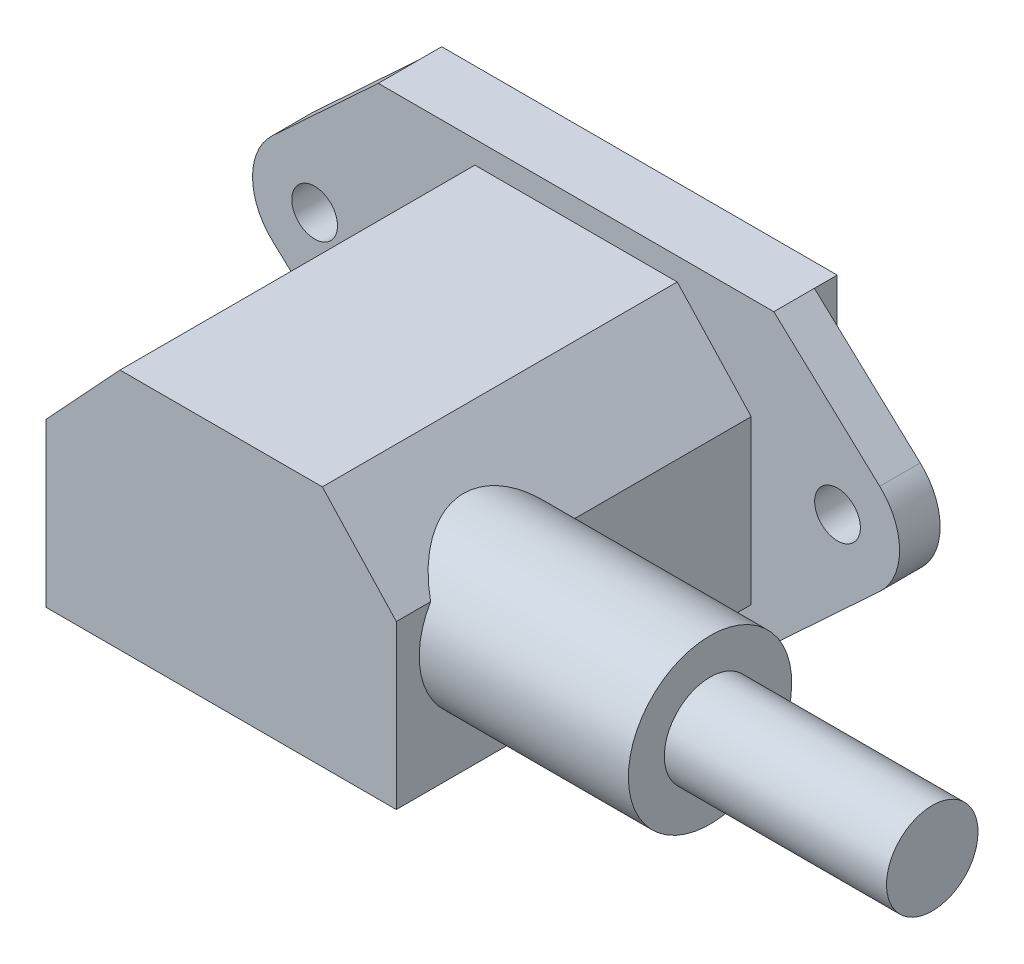
ISO-10303-21;
HEADER;
FILE_DESCRIPTION(('STEP AP214'),'2;1');
FILE_NAME('part.step','',(''),(''),'','','');
FILE_SCHEMA(('AUTOMOTIVE_DESIGN { 1 0 10303 214 1 1 1 1 }'));
ENDSEC;
DATA;
#1=APPLICATION_CONTEXT('core data for automotive mechanical design processes');
#2=APPLICATION_PROTOCOL_DEFINITION('international standard','automotive_design',2000,#1);
#3=PRODUCT_CONTEXT('',#1,'mechanical');
#4=PRODUCT('Part','Part','',(#3));
#5=PRODUCT_RELATED_PRODUCT_CATEGORY('part','',(#4));
#6=PRODUCT_DEFINITION_FORMATION('','',#4);
#7=PRODUCT_DEFINITION_CONTEXT('part definition',#1,'design');
#8=PRODUCT_DEFINITION('design','',#6,#7);
#9=PRODUCT_DEFINITION_SHAPE('','',#8);
#10=(LENGTH_UNIT() NAMED_UNIT(*) SI_UNIT(.MILLI.,.METRE.));
#11=(NAMED_UNIT(*) PLANE_ANGLE_UNIT() SI_UNIT($,.RADIAN.));
#12=(NAMED_UNIT(*) SI_UNIT($,.STERADIAN.) SOLID_ANGLE_UNIT());
#13=UNCERTAINTY_MEASURE_WITH_UNIT(LENGTH_MEASURE(1.E-05),#10,'distance_accuracy_value','');
#14=(GEOMETRIC_REPRESENTATION_CONTEXT(3) GLOBAL_UNCERTAINTY_ASSIGNED_CONTEXT((#13)) GLOBAL_UNIT_ASSIGNED_CONTEXT((#10,
#11,#12)) REPRESENTATION_CONTEXT('',''));
#15=CARTESIAN_POINT('',(0.,0.,0.));
#16=DIRECTION('',(0.,0.,1.));
#17=DIRECTION('',(1.,0.,0.));
#18=AXIS2_PLACEMENT_3D('',#15,#16,#17);
#19=CARTESIAN_POINT('',(-20.,8.15,4.85));
#20=DIRECTION('',(0.,0.,1.));
#21=DIRECTION('',(1.,0.,0.));
#22=AXIS2_PLACEMENT_3D('',#19,#20,#21);
#23=PLANE('',#22);
#24=CARTESIAN_POINT('',(-20.,8.15,4.85));
#25=DIRECTION('',(0.,0.,1.));
#26=DIRECTION('',(1.,0.,0.));
#27=AXIS2_PLACEMENT_3D('',#24,#25,#26);
#28=CIRCLE('',#27,1.75);
#29=CARTESIAN_POINT('',(-21.75,8.15,4.85));
#30=VERTEX_POINT('',#29);
#31=EDGE_CURVE('E291',#30,#30,#28,.T.);
#32=ORIENTED_EDGE('',*,*,#31,.F.);
#33=EDGE_LOOP('',(#32));
#34=FACE_BOUND('',#33,.T.);
#35=DIRECTION('',(-0.73298236468774,-0.680247640978466,0.));
#36=VECTOR('',#35,1.);
#37=CARTESIAN_POINT('',(-15.13,19.15,4.85));
#38=LINE('',#37,#36);
#39=CARTESIAN_POINT('',(-15.13,19.15,4.85));
#40=VERTEX_POINT('',#39);
#41=CARTESIAN_POINT('',(-23.2311762946477,11.6316662322668,4.85));
#42=VERTEX_POINT('',#41);
#43=EDGE_CURVE('E297',#40,#42,#38,.T.);
#44=ORIENTED_EDGE('',*,*,#43,.T.);
#45=CARTESIAN_POINT('',(-20.,8.15,4.85));
#46=DIRECTION('',(0.,0.,1.));
#47=DIRECTION('',(1.,0.,0.));
#48=AXIS2_PLACEMENT_3D('',#45,#46,#47);
#49=CIRCLE('',#48,4.75000000000001);
#50=CARTESIAN_POINT('',(-23.2311762946477,4.66833376773322,4.85));
#51=VERTEX_POINT('',#50);
#52=EDGE_CURVE('E300',#42,#51,#49,.T.);
#53=ORIENTED_EDGE('',*,*,#52,.T.);
#54=DIRECTION('',(0.732982364687741,-0.680247640978466,0.));
#55=VECTOR('',#54,1.);
#56=CARTESIAN_POINT('',(-23.2311762946477,4.66833376773322,4.85));
#57=LINE('',#56,#55);
#58=CARTESIAN_POINT('',(-15.13,-2.85,4.85));
#59=VERTEX_POINT('',#58);
#60=EDGE_CURVE('E303',#51,#59,#57,.T.);
#61=ORIENTED_EDGE('',*,*,#60,.T.);
#62=DIRECTION('',(1.,0.,0.));
#63=VECTOR('',#62,1.);
#64=CARTESIAN_POINT('',(15.13,-2.85,4.85));
#65=LINE('',#64,#63);
#66=CARTESIAN_POINT('',(15.13,-2.85,4.85));
#67=VERTEX_POINT('',#66);
#68=EDGE_CURVE('E305',#59,#67,#65,.T.);
#69=ORIENTED_EDGE('',*,*,#68,.T.);
#70=DIRECTION('',(0.73298236468774,0.680247640978467,0.));
#71=VECTOR('',#70,1.);
#72=CARTESIAN_POINT('',(23.2311762946477,4.66833376773322,4.85));
#73=LINE('',#72,#71);
#74=CARTESIAN_POINT('',(23.2311762946477,4.66833376773322,4.85));
#75=VERTEX_POINT('',#74);
#76=EDGE_CURVE('E307',#67,#75,#73,.T.);
#77=ORIENTED_EDGE('',*,*,#76,.T.);
#78=CARTESIAN_POINT('',(20.,8.15,4.85));
#79=DIRECTION('',(0.,0.,1.));
#80=DIRECTION('',(-1.,0.,0.));
#81=AXIS2_PLACEMENT_3D('',#78,#79,#80);
#82=CIRCLE('',#81,4.75000000000001);
#83=CARTESIAN_POINT('',(23.2311762946477,11.6316662322668,4.85));
#84=VERTEX_POINT('',#83);
#85=EDGE_CURVE('E309',#75,#84,#82,.T.);
#86=ORIENTED_EDGE('',*,*,#85,.T.);
#87=DIRECTION('',(-0.73298236468774,0.680247640978467,0.));
#88=VECTOR('',#87,1.);
#89=CARTESIAN_POINT('',(15.13,19.15,4.85));
#90=LINE('',#89,#88);
#91=CARTESIAN_POINT('',(15.13,19.15,4.85));
#92=VERTEX_POINT('',#91);
#93=EDGE_CURVE('E311',#84,#92,#90,.T.);
#94=ORIENTED_EDGE('',*,*,#93,.T.);
#95=DIRECTION('',(-1.,0.,0.));
#96=VECTOR('',#95,1.);
#97=CARTESIAN_POINT('',(-15.13,19.15,4.85));
#98=LINE('',#97,#96);
#99=EDGE_CURVE('E313',#92,#40,#98,.T.);
#100=ORIENTED_EDGE('',*,*,#99,.T.);
#101=EDGE_LOOP('',(#44,#53,#61,#69,#77,#86,#94,#100));
#102=FACE_BOUND('',#101,.T.);
#103=CARTESIAN_POINT('',(20.,8.15,4.85));
#104=DIRECTION('',(0.,0.,1.));
#105=DIRECTION('',(1.,0.,0.));
#106=AXIS2_PLACEMENT_3D('',#103,#104,#105);
#107=CIRCLE('',#106,1.75);
#108=CARTESIAN_POINT('',(18.25,8.15,4.85));
#109=VERTEX_POINT('',#108);
#110=EDGE_CURVE('E285',#109,#109,#107,.T.);
#111=ORIENTED_EDGE('',*,*,#110,.F.);
#112=EDGE_LOOP('',(#111));
#113=FACE_BOUND('',#112,.T.);
#114=DIRECTION('',(0.,-1.,0.));
#115=VECTOR('',#114,1.);
#116=CARTESIAN_POINT('',(-13.4,-1.125,4.85));
#117=LINE('',#116,#115);
#118=CARTESIAN_POINT('',(-13.4,11.3328050600255,4.85));
#119=VERTEX_POINT('',#118);
#120=CARTESIAN_POINT('',(-13.4,-1.125,4.85));
#121=VERTEX_POINT('',#120);
#122=EDGE_CURVE('E236',#119,#121,#117,.T.);
#123=ORIENTED_EDGE('',*,*,#122,.F.);
#124=DIRECTION('',(-0.680716127536649,-0.732547304760252,0.));
#125=VECTOR('',#124,1.);
#126=CARTESIAN_POINT('',(-13.4,11.3328050600255,4.85));
#127=LINE('',#126,#125);
#128=CARTESIAN_POINT('',(-7.73885658879731,17.425,4.85));
#129=VERTEX_POINT('',#128);
#130=EDGE_CURVE('E57',#129,#119,#127,.T.);
#131=ORIENTED_EDGE('',*,*,#130,.F.);
#132=DIRECTION('',(-1.,0.,0.));
#133=VECTOR('',#132,1.);
#134=CARTESIAN_POINT('',(-7.73885658879731,17.425,4.85));
#135=LINE('',#134,#133);
#136=CARTESIAN_POINT('',(7.7388565887973,17.425,4.85));
#137=VERTEX_POINT('',#136);
#138=EDGE_CURVE('E265',#137,#129,#135,.T.);
#139=ORIENTED_EDGE('',*,*,#138,.F.);
#140=DIRECTION('',(-0.680716127536649,0.732547304760251,0.));
#141=VECTOR('',#140,1.);
#142=CARTESIAN_POINT('',(13.4,11.3328050600255,4.85));
#143=LINE('',#142,#141);
#144=CARTESIAN_POINT('',(13.4,11.3328050600255,4.85));
#145=VERTEX_POINT('',#144);
#146=EDGE_CURVE('E262',#145,#137,#143,.T.);
#147=ORIENTED_EDGE('',*,*,#146,.F.);
#148=DIRECTION('',(0.,1.,0.));
#149=VECTOR('',#148,1.);
#150=CARTESIAN_POINT('',(13.4,-1.12499999999999,4.85));
#151=LINE('',#150,#149);
#152=CARTESIAN_POINT('',(13.4,-1.12499999999999,4.85));
#153=VERTEX_POINT('',#152);
#154=EDGE_CURVE('E259',#153,#145,#151,.T.);
#155=ORIENTED_EDGE('',*,*,#154,.F.);
#156=DIRECTION('',(1.,0.,0.));
#157=VECTOR('',#156,1.);
#158=CARTESIAN_POINT('',(13.4,-1.12499999999999,4.85));
#159=LINE('',#158,#157);
#160=EDGE_CURVE('E256',#121,#153,#159,.T.);
#161=ORIENTED_EDGE('',*,*,#160,.F.);
#162=EDGE_LOOP('',(#123,#131,#139,#147,#155,#161));
#163=FACE_BOUND('',#162,.T.);
#164=ADVANCED_FACE('F34',(#34,#102,#113,#163),#23,.T.);
#165=CARTESIAN_POINT('',(0.,0.,0.));
#166=DIRECTION('',(0.,0.,-1.));
#167=DIRECTION('',(-1.,0.,0.));
#168=AXIS2_PLACEMENT_3D('',#165,#166,#167);
#169=PLANE('',#168);
#170=DIRECTION('',(0.,1.,0.));
#171=VECTOR('',#170,1.);
#172=CARTESIAN_POINT('',(15.13,-2.85,0.));
#173=LINE('',#172,#171);
#174=CARTESIAN_POINT('',(15.13,-2.85,0.));
#175=VERTEX_POINT('',#174);
#176=CARTESIAN_POINT('',(15.13,19.15,0.));
#177=VERTEX_POINT('',#176);
#178=EDGE_CURVE('E201',#175,#177,#173,.T.);
#179=ORIENTED_EDGE('',*,*,#178,.F.);
#180=DIRECTION('',(1.,0.,0.));
#181=VECTOR('',#180,1.);
#182=CARTESIAN_POINT('',(-15.13,-2.85,0.));
#183=LINE('',#182,#181);
#184=CARTESIAN_POINT('',(-15.13,-2.85,0.));
#185=VERTEX_POINT('',#184);
#186=EDGE_CURVE('E379',#185,#175,#183,.T.);
#187=ORIENTED_EDGE('',*,*,#186,.F.);
#188=DIRECTION('',(0.,-1.,0.));
#189=VECTOR('',#188,1.);
#190=CARTESIAN_POINT('',(-15.13,-2.85,0.));
#191=LINE('',#190,#189);
#192=CARTESIAN_POINT('',(-15.13,19.15,0.));
#193=VERTEX_POINT('',#192);
#194=EDGE_CURVE('E387',#193,#185,#191,.T.);
#195=ORIENTED_EDGE('',*,*,#194,.F.);
#196=DIRECTION('',(-1.,0.,0.));
#197=VECTOR('',#196,1.);
#198=CARTESIAN_POINT('',(-15.13,19.15,0.));
#199=LINE('',#198,#197);
#200=EDGE_CURVE('E385',#177,#193,#199,.T.);
#201=ORIENTED_EDGE('',*,*,#200,.F.);
#202=EDGE_LOOP('',(#179,#187,#195,#201));
#203=FACE_BOUND('',#202,.T.);
#204=DIRECTION('',(1.,0.,0.));
#205=VECTOR('',#204,1.);
#206=CARTESIAN_POINT('',(-12.175,0.,0.));
#207=LINE('',#206,#205);
#208=CARTESIAN_POINT('',(-12.175,0.,0.));
#209=VERTEX_POINT('',#208);
#210=CARTESIAN_POINT('',(12.175,0.,0.));
#211=VERTEX_POINT('',#210);
#212=EDGE_CURVE('E364',#209,#211,#207,.T.);
#213=ORIENTED_EDGE('',*,*,#212,.T.);
#214=DIRECTION('',(0.,1.,0.));
#215=VECTOR('',#214,1.);
#216=CARTESIAN_POINT('',(12.175,11.,0.));
#217=LINE('',#216,#215);
#218=CARTESIAN_POINT('',(12.175,11.,0.));
#219=VERTEX_POINT('',#218);
#220=EDGE_CURVE('E352',#211,#219,#217,.T.);
#221=ORIENTED_EDGE('',*,*,#220,.T.);
#222=DIRECTION('',(-0.680716127536649,0.732547304760252,0.));
#223=VECTOR('',#222,1.);
#224=CARTESIAN_POINT('',(7.25,16.3,0.));
#225=LINE('',#224,#223);
#226=CARTESIAN_POINT('',(7.25,16.3,0.));
#227=VERTEX_POINT('',#226);
#228=EDGE_CURVE('E198',#219,#227,#225,.T.);
#229=ORIENTED_EDGE('',*,*,#228,.T.);
#230=DIRECTION('',(-1.,0.,0.));
#231=VECTOR('',#230,1.);
#232=CARTESIAN_POINT('',(7.25,16.3,0.));
#233=LINE('',#232,#231);
#234=CARTESIAN_POINT('',(-7.25,16.3,0.));
#235=VERTEX_POINT('',#234);
#236=EDGE_CURVE('E355',#227,#235,#233,.T.);
#237=ORIENTED_EDGE('',*,*,#236,.T.);
#238=DIRECTION('',(-0.680716127536649,-0.732547304760252,0.));
#239=VECTOR('',#238,1.);
#240=CARTESIAN_POINT('',(-7.25,16.3,0.));
#241=LINE('',#240,#239);
#242=CARTESIAN_POINT('',(-12.175,11.,0.));
#243=VERTEX_POINT('',#242);
#244=EDGE_CURVE('E358',#235,#243,#241,.T.);
#245=ORIENTED_EDGE('',*,*,#244,.T.);
#246=DIRECTION('',(0.,-1.,0.));
#247=VECTOR('',#246,1.);
#248=CARTESIAN_POINT('',(-12.175,11.,0.));
#249=LINE('',#248,#247);
#250=EDGE_CURVE('E361',#243,#209,#249,.T.);
#251=ORIENTED_EDGE('',*,*,#250,.T.);
#252=EDGE_LOOP('',(#213,#221,#229,#237,#245,#251));
#253=FACE_BOUND('',#252,.T.);
#254=ADVANCED_FACE('F409',(#203,#253),#169,.T.);
#255=CARTESIAN_POINT('',(15.13,-2.85,1.75));
#256=DIRECTION('',(-1.,0.,0.));
#257=DIRECTION('',(0.,-1.,0.));
#258=AXIS2_PLACEMENT_3D('',#255,#256,#257);
#259=PLANE('',#258);
#260=ORIENTED_EDGE('',*,*,#178,.T.);
#261=DIRECTION('',(0.,0.,-1.));
#262=VECTOR('',#261,1.);
#263=CARTESIAN_POINT('',(15.13,19.15,1.75));
#264=LINE('',#263,#262);
#265=CARTESIAN_POINT('',(15.13,19.15,1.75));
#266=VERTEX_POINT('',#265);
#267=EDGE_CURVE('E38',#266,#177,#264,.T.);
#268=ORIENTED_EDGE('',*,*,#267,.F.);
#269=DIRECTION('',(0.,1.,0.));
#270=VECTOR('',#269,1.);
#271=CARTESIAN_POINT('',(15.13,-2.85,1.75));
#272=LINE('',#271,#270);
#273=CARTESIAN_POINT('',(15.13,-2.85,1.75));
#274=VERTEX_POINT('',#273);
#275=EDGE_CURVE('E375',#274,#266,#272,.T.);
#276=ORIENTED_EDGE('',*,*,#275,.F.);
#277=DIRECTION('',(0.,0.,-1.));
#278=VECTOR('',#277,1.);
#279=CARTESIAN_POINT('',(15.13,-2.85,1.75));
#280=LINE('',#279,#278);
#281=EDGE_CURVE('E382',#274,#175,#280,.T.);
#282=ORIENTED_EDGE('',*,*,#281,.T.);
#283=EDGE_LOOP('',(#260,#268,#276,#282));
#284=FACE_BOUND('',#283,.T.);
#285=ADVANCED_FACE('F36',(#284),#259,.F.);
#286=CARTESIAN_POINT('',(-15.13,19.15,1.75));
#287=DIRECTION('',(0.,-1.,0.));
#288=DIRECTION('',(1.,0.,0.));
#289=AXIS2_PLACEMENT_3D('',#286,#287,#288);
#290=PLANE('',#289);
#291=ORIENTED_EDGE('',*,*,#200,.T.);
#292=DIRECTION('',(0.,0.,-1.));
#293=VECTOR('',#292,1.);
#294=CARTESIAN_POINT('',(-15.13,19.15,1.75));
#295=LINE('',#294,#293);
#296=CARTESIAN_POINT('',(-15.13,19.15,1.75));
#297=VERTEX_POINT('',#296);
#298=EDGE_CURVE('E394',#297,#193,#295,.T.);
#299=ORIENTED_EDGE('',*,*,#298,.F.);
#300=DIRECTION('',(0.,0.,-1.));
#301=VECTOR('',#300,1.);
#302=CARTESIAN_POINT('',(-15.13,19.15,4.85));
#303=LINE('',#302,#301);
#304=EDGE_CURVE('E315',#40,#297,#303,.T.);
#305=ORIENTED_EDGE('',*,*,#304,.F.);
#306=ORIENTED_EDGE('',*,*,#99,.F.);
#307=DIRECTION('',(0.,0.,-1.));
#308=VECTOR('',#307,1.);
#309=CARTESIAN_POINT('',(15.13,19.15,4.85));
#310=LINE('',#309,#308);
#311=EDGE_CURVE('E331',#92,#266,#310,.T.);
#312=ORIENTED_EDGE('',*,*,#311,.T.);
#313=ORIENTED_EDGE('',*,*,#267,.T.);
#314=EDGE_LOOP('',(#291,#299,#305,#306,#312,#313));
#315=FACE_BOUND('',#314,.T.);
#316=ADVANCED_FACE('F401',(#315),#290,.F.);
#317=CARTESIAN_POINT('',(-15.13,-2.85,1.75));
#318=DIRECTION('',(1.,0.,0.));
#319=DIRECTION('',(0.,1.,0.));
#320=AXIS2_PLACEMENT_3D('',#317,#318,#319);
#321=PLANE('',#320);
#322=ORIENTED_EDGE('',*,*,#194,.T.);
#323=DIRECTION('',(0.,0.,-1.));
#324=VECTOR('',#323,1.);
#325=CARTESIAN_POINT('',(-15.13,-2.85,1.75));
#326=LINE('',#325,#324);
#327=CARTESIAN_POINT('',(-15.13,-2.85,1.75));
#328=VERTEX_POINT('',#327);
#329=EDGE_CURVE('E392',#328,#185,#326,.T.);
#330=ORIENTED_EDGE('',*,*,#329,.F.);
#331=DIRECTION('',(0.,-1.,0.));
#332=VECTOR('',#331,1.);
#333=CARTESIAN_POINT('',(-15.13,-2.85,1.75));
#334=LINE('',#333,#332);
#335=EDGE_CURVE('E378',#297,#328,#334,.T.);
#336=ORIENTED_EDGE('',*,*,#335,.F.);
#337=ORIENTED_EDGE('',*,*,#298,.T.);
#338=EDGE_LOOP('',(#322,#330,#336,#337));
#339=FACE_BOUND('',#338,.T.);
#340=ADVANCED_FACE('F411',(#339),#321,.F.);
#341=CARTESIAN_POINT('',(-15.13,-2.85,1.75));
#342=DIRECTION('',(0.,1.,0.));
#343=DIRECTION('',(0.,0.,1.));
#344=AXIS2_PLACEMENT_3D('',#341,#342,#343);
#345=PLANE('',#344);
#346=ORIENTED_EDGE('',*,*,#186,.T.);
#347=ORIENTED_EDGE('',*,*,#281,.F.);
#348=DIRECTION('',(0.,0.,-1.));
#349=VECTOR('',#348,1.);
#350=CARTESIAN_POINT('',(15.13,-2.85,4.85));
#351=LINE('',#350,#349);
#352=EDGE_CURVE('E340',#67,#274,#351,.T.);
#353=ORIENTED_EDGE('',*,*,#352,.F.);
#354=ORIENTED_EDGE('',*,*,#68,.F.);
#355=DIRECTION('',(0.,0.,-1.));
#356=VECTOR('',#355,1.);
#357=CARTESIAN_POINT('',(-15.13,-2.85,4.85));
#358=LINE('',#357,#356);
#359=EDGE_CURVE('E343',#59,#328,#358,.T.);
#360=ORIENTED_EDGE('',*,*,#359,.T.);
#361=ORIENTED_EDGE('',*,*,#329,.T.);
#362=EDGE_LOOP('',(#346,#347,#353,#354,#360,#361));
#363=FACE_BOUND('',#362,.T.);
#364=ADVANCED_FACE('F413',(#363),#345,.F.);
#365=CARTESIAN_POINT('',(12.175,11.,1.75));
#366=DIRECTION('',(-1.,0.,0.));
#367=DIRECTION('',(0.,-1.,0.));
#368=AXIS2_PLACEMENT_3D('',#365,#366,#367);
#369=PLANE('',#368);
#370=ORIENTED_EDGE('',*,*,#220,.F.);
#371=DIRECTION('',(0.,0.,-1.));
#372=VECTOR('',#371,1.);
#373=CARTESIAN_POINT('',(12.175,0.,1.75));
#374=LINE('',#373,#372);
#375=CARTESIAN_POINT('',(12.175,0.,18.75));
#376=VERTEX_POINT('',#375);
#377=EDGE_CURVE('E208',#376,#211,#374,.T.);
#378=ORIENTED_EDGE('',*,*,#377,.F.);
#379=DIRECTION('',(0.,-1.,0.));
#380=VECTOR('',#379,1.);
#381=CARTESIAN_POINT('',(12.175,11.,18.75));
#382=LINE('',#381,#380);
#383=CARTESIAN_POINT('',(12.175,11.,18.75));
#384=VERTEX_POINT('',#383);
#385=EDGE_CURVE('E205',#384,#376,#382,.T.);
#386=ORIENTED_EDGE('',*,*,#385,.F.);
#387=DIRECTION('',(0.,0.,-1.));
#388=VECTOR('',#387,1.);
#389=CARTESIAN_POINT('',(12.175,11.,1.75));
#390=LINE('',#389,#388);
#391=EDGE_CURVE('E191',#384,#219,#390,.T.);
#392=ORIENTED_EDGE('',*,*,#391,.T.);
#393=EDGE_LOOP('',(#370,#378,#386,#392));
#394=FACE_BOUND('',#393,.T.);
#395=ADVANCED_FACE('F206',(#394),#369,.T.);
#396=CARTESIAN_POINT('',(7.25,16.3,1.75));
#397=DIRECTION('',(-0.732547304760252,-0.680716127536649,0.));
#398=DIRECTION('',(0.680716127536649,-0.732547304760252,0.));
#399=AXIS2_PLACEMENT_3D('',#396,#397,#398);
#400=PLANE('',#399);
#401=ORIENTED_EDGE('',*,*,#228,.F.);
#402=ORIENTED_EDGE('',*,*,#391,.F.);
#403=DIRECTION('',(0.680716127536649,-0.732547304760252,0.));
#404=VECTOR('',#403,1.);
#405=CARTESIAN_POINT('',(7.25,16.3,18.75));
#406=LINE('',#405,#404);
#407=CARTESIAN_POINT('',(7.25,16.3,18.75));
#408=VERTEX_POINT('',#407);
#409=EDGE_CURVE('E195',#408,#384,#406,.T.);
#410=ORIENTED_EDGE('',*,*,#409,.F.);
#411=DIRECTION('',(0.,0.,-1.));
#412=VECTOR('',#411,1.);
#413=CARTESIAN_POINT('',(7.25,16.3,1.75));
#414=LINE('',#413,#412);
#415=EDGE_CURVE('E202',#408,#227,#414,.T.);
#416=ORIENTED_EDGE('',*,*,#415,.T.);
#417=EDGE_LOOP('',(#401,#402,#410,#416));
#418=FACE_BOUND('',#417,.T.);
#419=ADVANCED_FACE('F193',(#418),#400,.T.);
#420=CARTESIAN_POINT('',(7.25,16.3,1.75));
#421=DIRECTION('',(0.,-1.,0.));
#422=DIRECTION('',(0.,0.,-1.));
#423=AXIS2_PLACEMENT_3D('',#420,#421,#422);
#424=PLANE('',#423);
#425=ORIENTED_EDGE('',*,*,#236,.F.);
#426=ORIENTED_EDGE('',*,*,#415,.F.);
#427=DIRECTION('',(1.,0.,0.));
#428=VECTOR('',#427,1.);
#429=CARTESIAN_POINT('',(-7.25,16.3,18.75));
#430=LINE('',#429,#428);
#431=CARTESIAN_POINT('',(-7.25,16.3,18.75));
#432=VERTEX_POINT('',#431);
#433=EDGE_CURVE('E217',#432,#408,#430,.T.);
#434=ORIENTED_EDGE('',*,*,#433,.F.);
#435=DIRECTION('',(0.,0.,-1.));
#436=VECTOR('',#435,1.);
#437=CARTESIAN_POINT('',(-7.25,16.3,1.75));
#438=LINE('',#437,#436);
#439=EDGE_CURVE('E372',#432,#235,#438,.T.);
#440=ORIENTED_EDGE('',*,*,#439,.T.);
#441=EDGE_LOOP('',(#425,#426,#434,#440));
#442=FACE_BOUND('',#441,.T.);
#443=ADVANCED_FACE('F628',(#442),#424,.T.);
#444=CARTESIAN_POINT('',(-7.25,16.3,1.75));
#445=DIRECTION('',(0.732547304760252,-0.680716127536649,0.));
#446=DIRECTION('',(0.680716127536649,0.732547304760252,0.));
#447=AXIS2_PLACEMENT_3D('',#444,#445,#446);
#448=PLANE('',#447);
#449=ORIENTED_EDGE('',*,*,#244,.F.);
#450=ORIENTED_EDGE('',*,*,#439,.F.);
#451=DIRECTION('',(0.680716127536649,0.732547304760252,0.));
#452=VECTOR('',#451,1.);
#453=CARTESIAN_POINT('',(-12.175,11.,18.75));
#454=LINE('',#453,#452);
#455=CARTESIAN_POINT('',(-12.175,11.,18.75));
#456=VERTEX_POINT('',#455);
#457=EDGE_CURVE('E224',#456,#432,#454,.T.);
#458=ORIENTED_EDGE('',*,*,#457,.F.);
#459=DIRECTION('',(0.,0.,-1.));
#460=VECTOR('',#459,1.);
#461=CARTESIAN_POINT('',(-12.175,11.,1.75));
#462=LINE('',#461,#460);
#463=EDGE_CURVE('E370',#456,#243,#462,.T.);
#464=ORIENTED_EDGE('',*,*,#463,.T.);
#465=EDGE_LOOP('',(#449,#450,#458,#464));
#466=FACE_BOUND('',#465,.T.);
#467=ADVANCED_FACE('F617',(#466),#448,.T.);
#468=CARTESIAN_POINT('',(-12.175,11.,1.75));
#469=DIRECTION('',(1.,0.,0.));
#470=DIRECTION('',(0.,1.,0.));
#471=AXIS2_PLACEMENT_3D('',#468,#469,#470);
#472=PLANE('',#471);
#473=ORIENTED_EDGE('',*,*,#250,.F.);
#474=ORIENTED_EDGE('',*,*,#463,.F.);
#475=DIRECTION('',(0.,1.,0.));
#476=VECTOR('',#475,1.);
#477=CARTESIAN_POINT('',(-12.175,0.,18.75));
#478=LINE('',#477,#476);
#479=CARTESIAN_POINT('',(-12.175,0.,18.75));
#480=VERTEX_POINT('',#479);
#481=EDGE_CURVE('E221',#480,#456,#478,.T.);
#482=ORIENTED_EDGE('',*,*,#481,.F.);
#483=DIRECTION('',(0.,0.,-1.));
#484=VECTOR('',#483,1.);
#485=CARTESIAN_POINT('',(-12.175,0.,1.75));
#486=LINE('',#485,#484);
#487=EDGE_CURVE('E368',#480,#209,#486,.T.);
#488=ORIENTED_EDGE('',*,*,#487,.T.);
#489=EDGE_LOOP('',(#473,#474,#482,#488));
#490=FACE_BOUND('',#489,.T.);
#491=ADVANCED_FACE('F606',(#490),#472,.T.);
#492=CARTESIAN_POINT('',(-12.175,0.,1.75));
#493=DIRECTION('',(0.,1.,0.));
#494=DIRECTION('',(0.,0.,1.));
#495=AXIS2_PLACEMENT_3D('',#492,#493,#494);
#496=PLANE('',#495);
#497=ORIENTED_EDGE('',*,*,#212,.F.);
#498=ORIENTED_EDGE('',*,*,#487,.F.);
#499=DIRECTION('',(-1.,0.,0.));
#500=VECTOR('',#499,1.);
#501=CARTESIAN_POINT('',(12.175,0.,18.75));
#502=LINE('',#501,#500);
#503=EDGE_CURVE('E212',#376,#480,#502,.T.);
#504=ORIENTED_EDGE('',*,*,#503,.F.);
#505=ORIENTED_EDGE('',*,*,#377,.T.);
#506=EDGE_LOOP('',(#497,#498,#504,#505));
#507=FACE_BOUND('',#506,.T.);
#508=ADVANCED_FACE('F470',(#507),#496,.T.);
#509=CARTESIAN_POINT('',(-20.,8.15,1.75));
#510=DIRECTION('',(0.,0.,1.));
#511=DIRECTION('',(1.,0.,0.));
#512=AXIS2_PLACEMENT_3D('',#509,#510,#511);
#513=PLANE('',#512);
#514=CARTESIAN_POINT('',(20.,8.15,1.75));
#515=DIRECTION('',(0.,0.,1.));
#516=DIRECTION('',(1.,0.,0.));
#517=AXIS2_PLACEMENT_3D('',#514,#515,#516);
#518=CIRCLE('',#517,1.75);
#519=CARTESIAN_POINT('',(18.25,8.15,1.75));
#520=VERTEX_POINT('',#519);
#521=EDGE_CURVE('E253',#520,#520,#518,.T.);
#522=ORIENTED_EDGE('',*,*,#521,.T.);
#523=EDGE_LOOP('',(#522));
#524=FACE_BOUND('',#523,.T.);
#525=DIRECTION('',(0.73298236468774,0.680247640978467,0.));
#526=VECTOR('',#525,1.);
#527=CARTESIAN_POINT('',(23.2311762946477,4.66833376773322,1.75));
#528=LINE('',#527,#526);
#529=CARTESIAN_POINT('',(23.2311762946477,4.66833376773322,1.75));
#530=VERTEX_POINT('',#529);
#531=EDGE_CURVE('E323',#274,#530,#528,.T.);
#532=ORIENTED_EDGE('',*,*,#531,.F.);
#533=ORIENTED_EDGE('',*,*,#275,.T.);
#534=DIRECTION('',(-0.73298236468774,0.680247640978467,0.));
#535=VECTOR('',#534,1.);
#536=CARTESIAN_POINT('',(15.13,19.15,1.75));
#537=LINE('',#536,#535);
#538=CARTESIAN_POINT('',(23.2311762946477,11.6316662322668,1.75));
#539=VERTEX_POINT('',#538);
#540=EDGE_CURVE('E301',#539,#266,#537,.T.);
#541=ORIENTED_EDGE('',*,*,#540,.F.);
#542=CARTESIAN_POINT('',(20.,8.15,1.75));
#543=DIRECTION('',(0.,0.,1.));
#544=DIRECTION('',(-1.,0.,0.));
#545=AXIS2_PLACEMENT_3D('',#542,#543,#544);
#546=CIRCLE('',#545,4.75000000000001);
#547=EDGE_CURVE('E325',#530,#539,#546,.T.);
#548=ORIENTED_EDGE('',*,*,#547,.F.);
#549=EDGE_LOOP('',(#532,#533,#541,#548));
#550=FACE_BOUND('',#549,.T.);
#551=ADVANCED_FACE('F441',(#524,#550),#513,.F.);
#552=CARTESIAN_POINT('',(-20.,8.15,1.75));
#553=DIRECTION('',(0.,0.,1.));
#554=DIRECTION('',(1.,0.,0.));
#555=AXIS2_PLACEMENT_3D('',#552,#553,#554);
#556=CIRCLE('',#555,1.75);
#557=CARTESIAN_POINT('',(-21.75,8.15,1.75));
#558=VERTEX_POINT('',#557);
#559=EDGE_CURVE('E288',#558,#558,#556,.T.);
#560=ORIENTED_EDGE('',*,*,#559,.T.);
#561=EDGE_LOOP('',(#560));
#562=FACE_BOUND('',#561,.T.);
#563=DIRECTION('',(-0.73298236468774,-0.680247640978466,0.));
#564=VECTOR('',#563,1.);
#565=CARTESIAN_POINT('',(-15.13,19.15,1.75));
#566=LINE('',#565,#564);
#567=CARTESIAN_POINT('',(-23.2311762946477,11.6316662322668,1.75));
#568=VERTEX_POINT('',#567);
#569=EDGE_CURVE('E294',#297,#568,#566,.T.);
#570=ORIENTED_EDGE('',*,*,#569,.F.);
#571=ORIENTED_EDGE('',*,*,#335,.T.);
#572=DIRECTION('',(0.732982364687741,-0.680247640978466,0.));
#573=VECTOR('',#572,1.);
#574=CARTESIAN_POINT('',(-23.2311762946477,4.66833376773322,1.75));
#575=LINE('',#574,#573);
#576=CARTESIAN_POINT('',(-23.2311762946477,4.66833376773322,1.75));
#577=VERTEX_POINT('',#576);
#578=EDGE_CURVE('E320',#577,#328,#575,.T.);
#579=ORIENTED_EDGE('',*,*,#578,.F.);
#580=CARTESIAN_POINT('',(-20.,8.15,1.75));
#581=DIRECTION('',(0.,0.,1.));
#582=DIRECTION('',(1.,0.,0.));
#583=AXIS2_PLACEMENT_3D('',#580,#581,#582);
#584=CIRCLE('',#583,4.75000000000001);
#585=EDGE_CURVE('E318',#568,#577,#584,.T.);
#586=ORIENTED_EDGE('',*,*,#585,.F.);
#587=EDGE_LOOP('',(#570,#571,#579,#586));
#588=FACE_BOUND('',#587,.T.);
#589=ADVANCED_FACE('F424',(#562,#588),#513,.F.);
#590=CARTESIAN_POINT('',(-15.13,19.15,4.85));
#591=DIRECTION('',(0.680247640978466,-0.73298236468774,0.));
#592=DIRECTION('',(0.73298236468774,0.680247640978466,0.));
#593=AXIS2_PLACEMENT_3D('',#590,#591,#592);
#594=PLANE('',#593);
#595=ORIENTED_EDGE('',*,*,#569,.T.);
#596=DIRECTION('',(0.,0.,-1.));
#597=VECTOR('',#596,1.);
#598=CARTESIAN_POINT('',(-23.2311762946477,11.6316662322668,4.85));
#599=LINE('',#598,#597);
#600=EDGE_CURVE('E349',#42,#568,#599,.T.);
#601=ORIENTED_EDGE('',*,*,#600,.F.);
#602=ORIENTED_EDGE('',*,*,#43,.F.);
#603=ORIENTED_EDGE('',*,*,#304,.T.);
#604=EDGE_LOOP('',(#595,#601,#602,#603));
#605=FACE_BOUND('',#604,.T.);
#606=ADVANCED_FACE('F428',(#605),#594,.F.);
#607=CARTESIAN_POINT('',(-20.,8.15,4.85));
#608=DIRECTION('',(0.,0.,-1.));
#609=DIRECTION('',(-1.,0.,0.));
#610=AXIS2_PLACEMENT_3D('',#607,#608,#609);
#611=CYLINDRICAL_SURFACE('',#610,4.75000000000001);
#612=ORIENTED_EDGE('',*,*,#585,.T.);
#613=DIRECTION('',(0.,0.,-1.));
#614=VECTOR('',#613,1.);
#615=CARTESIAN_POINT('',(-23.2311762946477,4.66833376773322,4.85));
#616=LINE('',#615,#614);
#617=EDGE_CURVE('E346',#51,#577,#616,.T.);
#618=ORIENTED_EDGE('',*,*,#617,.F.);
#619=ORIENTED_EDGE('',*,*,#52,.F.);
#620=ORIENTED_EDGE('',*,*,#600,.T.);
#621=EDGE_LOOP('',(#612,#618,#619,#620));
#622=FACE_BOUND('',#621,.T.);
#623=ADVANCED_FACE('F447',(#622),#611,.T.);
#624=CARTESIAN_POINT('',(-23.2311762946477,4.66833376773322,4.85));
#625=DIRECTION('',(0.680247640978466,0.732982364687741,0.));
#626=DIRECTION('',(-0.732982364687741,0.680247640978466,0.));
#627=AXIS2_PLACEMENT_3D('',#624,#625,#626);
#628=PLANE('',#627);
#629=ORIENTED_EDGE('',*,*,#578,.T.);
#630=ORIENTED_EDGE('',*,*,#359,.F.);
#631=ORIENTED_EDGE('',*,*,#60,.F.);
#632=ORIENTED_EDGE('',*,*,#617,.T.);
#633=EDGE_LOOP('',(#629,#630,#631,#632));
#634=FACE_BOUND('',#633,.T.);
#635=ADVANCED_FACE('F419',(#634),#628,.F.);
#636=CARTESIAN_POINT('',(23.2311762946477,4.66833376773322,4.85));
#637=DIRECTION('',(-0.680247640978467,0.73298236468774,0.));
#638=DIRECTION('',(-0.73298236468774,-0.680247640978467,0.));
#639=AXIS2_PLACEMENT_3D('',#636,#637,#638);
#640=PLANE('',#639);
#641=ORIENTED_EDGE('',*,*,#531,.T.);
#642=DIRECTION('',(0.,0.,-1.));
#643=VECTOR('',#642,1.);
#644=CARTESIAN_POINT('',(23.2311762946477,4.66833376773322,4.85));
#645=LINE('',#644,#643);
#646=EDGE_CURVE('E337',#75,#530,#645,.T.);
#647=ORIENTED_EDGE('',*,*,#646,.F.);
#648=ORIENTED_EDGE('',*,*,#76,.F.);
#649=ORIENTED_EDGE('',*,*,#352,.T.);
#650=EDGE_LOOP('',(#641,#647,#648,#649));
#651=FACE_BOUND('',#650,.T.);
#652=ADVANCED_FACE('F444',(#651),#640,.F.);
#653=CARTESIAN_POINT('',(20.,8.15,4.85));
#654=DIRECTION('',(0.,0.,-1.));
#655=DIRECTION('',(-1.,0.,0.));
#656=AXIS2_PLACEMENT_3D('',#653,#654,#655);
#657=CYLINDRICAL_SURFACE('',#656,4.75000000000001);
#658=ORIENTED_EDGE('',*,*,#547,.T.);
#659=DIRECTION('',(0.,0.,-1.));
#660=VECTOR('',#659,1.);
#661=CARTESIAN_POINT('',(23.2311762946477,11.6316662322668,4.85));
#662=LINE('',#661,#660);
#663=EDGE_CURVE('E334',#84,#539,#662,.T.);
#664=ORIENTED_EDGE('',*,*,#663,.F.);
#665=ORIENTED_EDGE('',*,*,#85,.F.);
#666=ORIENTED_EDGE('',*,*,#646,.T.);
#667=EDGE_LOOP('',(#658,#664,#665,#666));
#668=FACE_BOUND('',#667,.T.);
#669=ADVANCED_FACE('F474',(#668),#657,.T.);
#670=CARTESIAN_POINT('',(15.13,19.15,4.85));
#671=DIRECTION('',(-0.680247640978467,-0.73298236468774,0.));
#672=DIRECTION('',(0.73298236468774,-0.680247640978467,0.));
#673=AXIS2_PLACEMENT_3D('',#670,#671,#672);
#674=PLANE('',#673);
#675=ORIENTED_EDGE('',*,*,#540,.T.);
#676=ORIENTED_EDGE('',*,*,#311,.F.);
#677=ORIENTED_EDGE('',*,*,#93,.F.);
#678=ORIENTED_EDGE('',*,*,#663,.T.);
#679=EDGE_LOOP('',(#675,#676,#677,#678));
#680=FACE_BOUND('',#679,.T.);
#681=ADVANCED_FACE('F436',(#680),#674,.F.);
#682=CARTESIAN_POINT('',(-20.,8.15,4.85));
#683=DIRECTION('',(0.,0.,-1.));
#684=DIRECTION('',(-1.,0.,0.));
#685=AXIS2_PLACEMENT_3D('',#682,#683,#684);
#686=CYLINDRICAL_SURFACE('',#685,1.75);
#687=CARTESIAN_POINT('',(-21.75,8.15,4.85));
#688=CARTESIAN_POINT('',(-21.75,8.15,4.81770833333333));
#689=CARTESIAN_POINT('',(-21.75,8.15,4.78541666666667));
#690=CARTESIAN_POINT('',(-21.75,8.15,4.72083333333333));
#691=CARTESIAN_POINT('',(-21.75,8.15,4.68854166666667));
#692=CARTESIAN_POINT('',(-21.75,8.15,4.62395833333333));
#693=CARTESIAN_POINT('',(-21.75,8.15,4.59166666666667));
#694=CARTESIAN_POINT('',(-21.75,8.15,4.52708333333333));
#695=CARTESIAN_POINT('',(-21.75,8.15,4.49479166666667));
#696=CARTESIAN_POINT('',(-21.75,8.15,4.43020833333333));
#697=CARTESIAN_POINT('',(-21.75,8.15,4.39791666666667));
#698=CARTESIAN_POINT('',(-21.75,8.15,4.33333333333333));
#699=CARTESIAN_POINT('',(-21.75,8.15,4.30104166666667));
#700=CARTESIAN_POINT('',(-21.75,8.15,4.23645833333333));
#701=CARTESIAN_POINT('',(-21.75,8.15,4.20416666666667));
#702=CARTESIAN_POINT('',(-21.75,8.15,4.13958333333333));
#703=CARTESIAN_POINT('',(-21.75,8.15,4.10729166666667));
#704=CARTESIAN_POINT('',(-21.75,8.15,4.04270833333333));
#705=CARTESIAN_POINT('',(-21.75,8.15,4.01041666666667));
#706=CARTESIAN_POINT('',(-21.75,8.15,3.94583333333333));
#707=CARTESIAN_POINT('',(-21.75,8.15,3.91354166666667));
#708=CARTESIAN_POINT('',(-21.75,8.15,3.84895833333333));
#709=CARTESIAN_POINT('',(-21.75,8.15,3.81666666666667));
#710=CARTESIAN_POINT('',(-21.75,8.15,3.75208333333333));
#711=CARTESIAN_POINT('',(-21.75,8.15,3.71979166666667));
#712=CARTESIAN_POINT('',(-21.75,8.15,3.65520833333333));
#713=CARTESIAN_POINT('',(-21.75,8.15,3.62291666666667));
#714=CARTESIAN_POINT('',(-21.75,8.15,3.55833333333333));
#715=CARTESIAN_POINT('',(-21.75,8.15,3.52604166666667));
#716=CARTESIAN_POINT('',(-21.75,8.15,3.46145833333333));
#717=CARTESIAN_POINT('',(-21.75,8.15,3.42916666666667));
#718=CARTESIAN_POINT('',(-21.75,8.15,3.36458333333333));
#719=CARTESIAN_POINT('',(-21.75,8.15,3.33229166666667));
#720=CARTESIAN_POINT('',(-21.75,8.15,3.26770833333333));
#721=CARTESIAN_POINT('',(-21.75,8.15,3.23541666666667));
#722=CARTESIAN_POINT('',(-21.75,8.15,3.17083333333333));
#723=CARTESIAN_POINT('',(-21.75,8.15,3.13854166666667));
#724=CARTESIAN_POINT('',(-21.75,8.15,3.07395833333333));
#725=CARTESIAN_POINT('',(-21.75,8.15,3.04166666666667));
#726=CARTESIAN_POINT('',(-21.75,8.15,2.97708333333333));
#727=CARTESIAN_POINT('',(-21.75,8.15,2.94479166666667));
#728=CARTESIAN_POINT('',(-21.75,8.15,2.88020833333333));
#729=CARTESIAN_POINT('',(-21.75,8.15,2.84791666666667));
#730=CARTESIAN_POINT('',(-21.75,8.15,2.78333333333333));
#731=CARTESIAN_POINT('',(-21.75,8.15,2.75104166666667));
#732=CARTESIAN_POINT('',(-21.75,8.15,2.68645833333333));
#733=CARTESIAN_POINT('',(-21.75,8.15,2.65416666666667));
#734=CARTESIAN_POINT('',(-21.75,8.15,2.58958333333333));
#735=CARTESIAN_POINT('',(-21.75,8.15,2.55729166666667));
#736=CARTESIAN_POINT('',(-21.75,8.15,2.49270833333333));
#737=CARTESIAN_POINT('',(-21.75,8.15,2.46041666666667));
#738=CARTESIAN_POINT('',(-21.75,8.15,2.39583333333333));
#739=CARTESIAN_POINT('',(-21.75,8.15,2.36354166666667));
#740=CARTESIAN_POINT('',(-21.75,8.15,2.29895833333333));
#741=CARTESIAN_POINT('',(-21.75,8.15,2.26666666666667));
#742=CARTESIAN_POINT('',(-21.75,8.15,2.20208333333333));
#743=CARTESIAN_POINT('',(-21.75,8.15,2.16979166666667));
#744=CARTESIAN_POINT('',(-21.75,8.15,2.10520833333333));
#745=CARTESIAN_POINT('',(-21.75,8.15,2.07291666666667));
#746=CARTESIAN_POINT('',(-21.75,8.15,2.00833333333333));
#747=CARTESIAN_POINT('',(-21.75,8.15,1.97604166666667));
#748=CARTESIAN_POINT('',(-21.75,8.15,1.91145833333333));
#749=CARTESIAN_POINT('',(-21.75,8.15,1.87916666666667));
#750=CARTESIAN_POINT('',(-21.75,8.15,1.81458333333333));
#751=CARTESIAN_POINT('',(-21.75,8.15,1.78229166666667));
#752=CARTESIAN_POINT('',(-21.75,8.15,1.75));
#753=B_SPLINE_CURVE_WITH_KNOTS('',3,(#687,#688,#689,#690,#691,#692,#693,#694,#695,#696,#697,
#698,#699,#700,#701,#702,#703,#704,#705,#706,#707,#708,#709,#710,#711,#712,#713,#714,#715,#716,
#717,#718,#719,#720,#721,#722,#723,#724,#725,#726,#727,#728,#729,#730,#731,#732,#733,#734,#735,
#736,#737,#738,#739,#740,#741,#742,#743,#744,#745,#746,#747,#748,#749,#750,#751,#752),
.UNSPECIFIED.,.F.,.F.,(4,2,2,2,2,2,2,2,2,2,2,2,2,2,2,2,2,2,2,2,2,2,2,2,2,2,2,2,2,2,2,2,4),(0.,
0.0968750000000006,0.19375,0.290625,0.387500000000001,0.484375,0.58125,0.678125,0.775,0.871875,
0.96875,1.065625,1.1625,1.259375,1.35625,1.453125,1.55,1.646875,1.74375,1.840625,1.9375,
2.034375,2.13125,2.228125,2.325,2.421875,2.51875,2.615625,2.7125,2.809375,2.90625,3.003125,3.1),.UNSPECIFIED.);
#754=EDGE_CURVE('BSEAM466',#30,#558,#753,.T.);
#755=ORIENTED_EDGE('',*,*,#31,.T.);
#756=ORIENTED_EDGE('',*,*,#559,.F.);
#757=ORIENTED_EDGE('',*,*,#754,.T.);
#758=ORIENTED_EDGE('',*,*,#754,.F.);
#759=EDGE_LOOP('',(#755,#757,#756,#758));
#760=FACE_BOUND('',#759,.T.);
#761=ADVANCED_FACE('F466',(#760),#686,.F.);
#762=CARTESIAN_POINT('',(20.,8.15,4.85));
#763=DIRECTION('',(0.,0.,-1.));
#764=DIRECTION('',(-1.,0.,0.));
#765=AXIS2_PLACEMENT_3D('',#762,#763,#764);
#766=CYLINDRICAL_SURFACE('',#765,1.75);
#767=CARTESIAN_POINT('',(18.25,8.15,4.85));
#768=CARTESIAN_POINT('',(18.25,8.15,4.81770833333333));
#769=CARTESIAN_POINT('',(18.25,8.15,4.78541666666667));
#770=CARTESIAN_POINT('',(18.25,8.15,4.72083333333333));
#771=CARTESIAN_POINT('',(18.25,8.15,4.68854166666667));
#772=CARTESIAN_POINT('',(18.25,8.15,4.62395833333333));
#773=CARTESIAN_POINT('',(18.25,8.15,4.59166666666667));
#774=CARTESIAN_POINT('',(18.25,8.15,4.52708333333333));
#775=CARTESIAN_POINT('',(18.25,8.15,4.49479166666667));
#776=CARTESIAN_POINT('',(18.25,8.15,4.43020833333333));
#777=CARTESIAN_POINT('',(18.25,8.15,4.39791666666667));
#778=CARTESIAN_POINT('',(18.25,8.15,4.33333333333333));
#779=CARTESIAN_POINT('',(18.25,8.15,4.30104166666667));
#780=CARTESIAN_POINT('',(18.25,8.15,4.23645833333333));
#781=CARTESIAN_POINT('',(18.25,8.15,4.20416666666667));
#782=CARTESIAN_POINT('',(18.25,8.15,4.13958333333333));
#783=CARTESIAN_POINT('',(18.25,8.15,4.10729166666667));
#784=CARTESIAN_POINT('',(18.25,8.15,4.04270833333333));
#785=CARTESIAN_POINT('',(18.25,8.15,4.01041666666667));
#786=CARTESIAN_POINT('',(18.25,8.15,3.94583333333333));
#787=CARTESIAN_POINT('',(18.25,8.15,3.91354166666667));
#788=CARTESIAN_POINT('',(18.25,8.15,3.84895833333333));
#789=CARTESIAN_POINT('',(18.25,8.15,3.81666666666667));
#790=CARTESIAN_POINT('',(18.25,8.15,3.75208333333333));
#791=CARTESIAN_POINT('',(18.25,8.15,3.71979166666667));
#792=CARTESIAN_POINT('',(18.25,8.15,3.65520833333333));
#793=CARTESIAN_POINT('',(18.25,8.15,3.62291666666667));
#794=CARTESIAN_POINT('',(18.25,8.15,3.55833333333333));
#795=CARTESIAN_POINT('',(18.25,8.15,3.52604166666667));
#796=CARTESIAN_POINT('',(18.25,8.15,3.46145833333333));
#797=CARTESIAN_POINT('',(18.25,8.15,3.42916666666667));
#798=CARTESIAN_POINT('',(18.25,8.15,3.36458333333333));
#799=CARTESIAN_POINT('',(18.25,8.15,3.33229166666667));
#800=CARTESIAN_POINT('',(18.25,8.15,3.26770833333333));
#801=CARTESIAN_POINT('',(18.25,8.15,3.23541666666667));
#802=CARTESIAN_POINT('',(18.25,8.15,3.17083333333333));
#803=CARTESIAN_POINT('',(18.25,8.15,3.13854166666667));
#804=CARTESIAN_POINT('',(18.25,8.15,3.07395833333333));
#805=CARTESIAN_POINT('',(18.25,8.15,3.04166666666667));
#806=CARTESIAN_POINT('',(18.25,8.15,2.97708333333333));
#807=CARTESIAN_POINT('',(18.25,8.15,2.94479166666667));
#808=CARTESIAN_POINT('',(18.25,8.15,2.88020833333333));
#809=CARTESIAN_POINT('',(18.25,8.15,2.84791666666667));
#810=CARTESIAN_POINT('',(18.25,8.15,2.78333333333333));
#811=CARTESIAN_POINT('',(18.25,8.15,2.75104166666667));
#812=CARTESIAN_POINT('',(18.25,8.15,2.68645833333333));
#813=CARTESIAN_POINT('',(18.25,8.15,2.65416666666667));
#814=CARTESIAN_POINT('',(18.25,8.15,2.58958333333333));
#815=CARTESIAN_POINT('',(18.25,8.15,2.55729166666667));
#816=CARTESIAN_POINT('',(18.25,8.15,2.49270833333333));
#817=CARTESIAN_POINT('',(18.25,8.15,2.46041666666667));
#818=CARTESIAN_POINT('',(18.25,8.15,2.39583333333333));
#819=CARTESIAN_POINT('',(18.25,8.15,2.36354166666667));
#820=CARTESIAN_POINT('',(18.25,8.15,2.29895833333333));
#821=CARTESIAN_POINT('',(18.25,8.15,2.26666666666667));
#822=CARTESIAN_POINT('',(18.25,8.15,2.20208333333333));
#823=CARTESIAN_POINT('',(18.25,8.15,2.16979166666667));
#824=CARTESIAN_POINT('',(18.25,8.15,2.10520833333333));
#825=CARTESIAN_POINT('',(18.25,8.15,2.07291666666667));
#826=CARTESIAN_POINT('',(18.25,8.15,2.00833333333333));
#827=CARTESIAN_POINT('',(18.25,8.15,1.97604166666667));
#828=CARTESIAN_POINT('',(18.25,8.15,1.91145833333333));
#829=CARTESIAN_POINT('',(18.25,8.15,1.87916666666667));
#830=CARTESIAN_POINT('',(18.25,8.15,1.81458333333333));
#831=CARTESIAN_POINT('',(18.25,8.15,1.78229166666667));
#832=CARTESIAN_POINT('',(18.25,8.15,1.75));
#833=B_SPLINE_CURVE_WITH_KNOTS('',3,(#767,#768,#769,#770,#771,#772,#773,#774,#775,#776,#777,
#778,#779,#780,#781,#782,#783,#784,#785,#786,#787,#788,#789,#790,#791,#792,#793,#794,#795,#796,
#797,#798,#799,#800,#801,#802,#803,#804,#805,#806,#807,#808,#809,#810,#811,#812,#813,#814,#815,
#816,#817,#818,#819,#820,#821,#822,#823,#824,#825,#826,#827,#828,#829,#830,#831,#832),
.UNSPECIFIED.,.F.,.F.,(4,2,2,2,2,2,2,2,2,2,2,2,2,2,2,2,2,2,2,2,2,2,2,2,2,2,2,2,2,2,2,2,4),(0.,
0.0968750000000006,0.19375,0.290625,0.387500000000001,0.484375,0.58125,0.678125,0.775,0.871875,
0.96875,1.065625,1.1625,1.259375,1.35625,1.453125,1.55,1.646875,1.74375,1.840625,1.9375,
2.034375,2.13125,2.228125,2.325,2.421875,2.51875,2.615625,2.7125,2.809375,2.90625,3.003125,3.1),.UNSPECIFIED.);
#834=EDGE_CURVE('BSEAM497',#109,#520,#833,.T.);
#835=ORIENTED_EDGE('',*,*,#110,.T.);
#836=ORIENTED_EDGE('',*,*,#521,.F.);
#837=ORIENTED_EDGE('',*,*,#834,.T.);
#838=ORIENTED_EDGE('',*,*,#834,.F.);
#839=EDGE_LOOP('',(#835,#837,#836,#838));
#840=FACE_BOUND('',#839,.T.);
#841=ADVANCED_FACE('F497',(#840),#766,.F.);
#842=CARTESIAN_POINT('',(-13.4,11.3328050600255,96.5935959967598));
#843=DIRECTION('',(0.732547304760252,-0.680716127536649,0.));
#844=DIRECTION('',(0.680716127536649,0.732547304760252,0.));
#845=AXIS2_PLACEMENT_3D('',#842,#843,#844);
#846=PLANE('',#845);
#847=DIRECTION('',(0.,0.,-1.));
#848=VECTOR('',#847,1.);
#849=CARTESIAN_POINT('',(-13.4,11.3328050600255,96.5935959967598));
#850=LINE('',#849,#848);
#851=CARTESIAN_POINT('',(-13.4,11.3328050600255,32.));
#852=VERTEX_POINT('',#851);
#853=EDGE_CURVE('E269',#852,#119,#850,.T.);
#854=ORIENTED_EDGE('',*,*,#853,.F.);
#855=DIRECTION('',(0.680716127536649,0.732547304760252,0.));
#856=VECTOR('',#855,1.);
#857=CARTESIAN_POINT('',(-13.4,11.3328050600255,32.));
#858=LINE('',#857,#856);
#859=CARTESIAN_POINT('',(-7.73885658879731,17.425,32.));
#860=VERTEX_POINT('',#859);
#861=EDGE_CURVE('E241',#852,#860,#858,.T.);
#862=ORIENTED_EDGE('',*,*,#861,.T.);
#863=DIRECTION('',(0.,0.,-1.));
#864=VECTOR('',#863,1.);
#865=CARTESIAN_POINT('',(-7.73885658879731,17.425,96.5935959967598));
#866=LINE('',#865,#864);
#867=EDGE_CURVE('E271',#860,#129,#866,.T.);
#868=ORIENTED_EDGE('',*,*,#867,.T.);
#869=ORIENTED_EDGE('',*,*,#130,.T.);
#870=EDGE_LOOP('',(#854,#862,#868,#869));
#871=FACE_BOUND('',#870,.T.);
#872=ADVANCED_FACE('F504',(#871),#846,.F.);
#873=CARTESIAN_POINT('',(-7.73885658879731,17.425,96.5935959967598));
#874=DIRECTION('',(0.,-1.,0.));
#875=DIRECTION('',(1.,0.,0.));
#876=AXIS2_PLACEMENT_3D('',#873,#874,#875);
#877=PLANE('',#876);
#878=ORIENTED_EDGE('',*,*,#867,.F.);
#879=DIRECTION('',(1.,0.,0.));
#880=VECTOR('',#879,1.);
#881=CARTESIAN_POINT('',(-7.73885658879731,17.425,32.));
#882=LINE('',#881,#880);
#883=CARTESIAN_POINT('',(7.7388565887973,17.425,32.));
#884=VERTEX_POINT('',#883);
#885=EDGE_CURVE('E237',#860,#884,#882,.T.);
#886=ORIENTED_EDGE('',*,*,#885,.T.);
#887=DIRECTION('',(0.,0.,-1.));
#888=VECTOR('',#887,1.);
#889=CARTESIAN_POINT('',(7.7388565887973,17.425,96.5935959967598));
#890=LINE('',#889,#888);
#891=EDGE_CURVE('E273',#884,#137,#890,.T.);
#892=ORIENTED_EDGE('',*,*,#891,.T.);
#893=ORIENTED_EDGE('',*,*,#138,.T.);
#894=EDGE_LOOP('',(#878,#886,#892,#893));
#895=FACE_BOUND('',#894,.T.);
#896=ADVANCED_FACE('F511',(#895),#877,.F.);
#897=CARTESIAN_POINT('',(13.4,11.3328050600255,96.5935959967598));
#898=DIRECTION('',(-0.732547304760251,-0.680716127536649,0.));
#899=DIRECTION('',(0.680716127536649,-0.732547304760251,0.));
#900=AXIS2_PLACEMENT_3D('',#897,#898,#899);
#901=PLANE('',#900);
#902=DIRECTION('',(0.,0.,-1.));
#903=VECTOR('',#902,1.);
#904=CARTESIAN_POINT('',(13.4,11.3328050600255,96.5935959967598));
#905=LINE('',#904,#903);
#906=CARTESIAN_POINT('',(13.4,11.3328050600255,32.));
#907=VERTEX_POINT('',#906);
#908=CARTESIAN_POINT('',(13.4,11.3328050600255,29.378870880573));
#909=VERTEX_POINT('',#908);
#910=EDGE_CURVE('E276',#907,#909,#905,.T.);
#911=ORIENTED_EDGE('',*,*,#910,.T.);
#912=CARTESIAN_POINT('',(16.3576065887973,8.14999999999999,24.));
#913=DIRECTION('',(-0.732547304760251,-0.680716127536649,0.));
#914=DIRECTION('',(0.680716127536649,-0.732547304760251,0.));
#915=AXIS2_PLACEMENT_3D('',#912,#913,#914);
#916=ELLIPSE('',#915,8.53187222092845,6.25);
#917=CARTESIAN_POINT('',(13.4,11.3328050600255,18.621129119427));
#918=VERTEX_POINT('',#917);
#919=EDGE_CURVE('E49',#918,#909,#916,.F.);
#920=ORIENTED_EDGE('',*,*,#919,.F.);
#921=EDGE_CURVE('E275',#918,#145,#905,.T.);
#922=ORIENTED_EDGE('',*,*,#921,.T.);
#923=ORIENTED_EDGE('',*,*,#146,.T.);
#924=ORIENTED_EDGE('',*,*,#891,.F.);
#925=DIRECTION('',(0.680716127536649,-0.732547304760251,0.));
#926=VECTOR('',#925,1.);
#927=CARTESIAN_POINT('',(13.4,11.3328050600255,32.));
#928=LINE('',#927,#926);
#929=EDGE_CURVE('E240',#884,#907,#928,.T.);
#930=ORIENTED_EDGE('',*,*,#929,.T.);
#931=EDGE_LOOP('',(#911,#920,#922,#923,#924,#930));
#932=FACE_BOUND('',#931,.T.);
#933=ADVANCED_FACE('F518',(#932),#901,.F.);
#934=CARTESIAN_POINT('',(13.4,-1.12499999999999,96.5935959967598));
#935=DIRECTION('',(-1.,0.,0.));
#936=DIRECTION('',(0.,-1.,0.));
#937=AXIS2_PLACEMENT_3D('',#934,#935,#936);
#938=PLANE('',#937);
#939=ORIENTED_EDGE('',*,*,#921,.F.);
#940=CARTESIAN_POINT('',(13.4,8.14999999999999,24.));
#941=DIRECTION('',(1.,0.,0.));
#942=DIRECTION('',(0.,1.,0.));
#943=AXIS2_PLACEMENT_3D('',#940,#941,#942);
#944=CIRCLE('',#943,6.25);
#945=EDGE_CURVE('E229',#909,#918,#944,.T.);
#946=ORIENTED_EDGE('',*,*,#945,.F.);
#947=ORIENTED_EDGE('',*,*,#910,.F.);
#948=DIRECTION('',(0.,-1.,0.));
#949=VECTOR('',#948,1.);
#950=CARTESIAN_POINT('',(13.4,-1.12499999999999,32.));
#951=LINE('',#950,#949);
#952=CARTESIAN_POINT('',(13.4,-1.12499999999999,32.));
#953=VERTEX_POINT('',#952);
#954=EDGE_CURVE('E244',#907,#953,#951,.T.);
#955=ORIENTED_EDGE('',*,*,#954,.T.);
#956=DIRECTION('',(0.,0.,-1.));
#957=VECTOR('',#956,1.);
#958=CARTESIAN_POINT('',(13.4,-1.12499999999999,96.5935959967598));
#959=LINE('',#958,#957);
#960=EDGE_CURVE('E279',#953,#153,#959,.T.);
#961=ORIENTED_EDGE('',*,*,#960,.T.);
#962=ORIENTED_EDGE('',*,*,#154,.T.);
#963=EDGE_LOOP('',(#939,#946,#947,#955,#961,#962));
#964=FACE_BOUND('',#963,.T.);
#965=ADVANCED_FACE('F527',(#964),#938,.F.);
#966=CARTESIAN_POINT('',(13.4,-1.12499999999999,96.5935959967598));
#967=DIRECTION('',(0.,1.,0.));
#968=DIRECTION('',(-1.,0.,0.));
#969=AXIS2_PLACEMENT_3D('',#966,#967,#968);
#970=PLANE('',#969);
#971=ORIENTED_EDGE('',*,*,#960,.F.);
#972=DIRECTION('',(-1.,0.,0.));
#973=VECTOR('',#972,1.);
#974=CARTESIAN_POINT('',(13.4,-1.12499999999999,32.));
#975=LINE('',#974,#973);
#976=CARTESIAN_POINT('',(-13.4,-1.125,32.));
#977=VERTEX_POINT('',#976);
#978=EDGE_CURVE('E247',#953,#977,#975,.T.);
#979=ORIENTED_EDGE('',*,*,#978,.T.);
#980=DIRECTION('',(0.,0.,-1.));
#981=VECTOR('',#980,1.);
#982=CARTESIAN_POINT('',(-13.4,-1.125,96.5935959967598));
#983=LINE('',#982,#981);
#984=EDGE_CURVE('E281',#977,#121,#983,.T.);
#985=ORIENTED_EDGE('',*,*,#984,.T.);
#986=ORIENTED_EDGE('',*,*,#160,.T.);
#987=EDGE_LOOP('',(#971,#979,#985,#986));
#988=FACE_BOUND('',#987,.T.);
#989=ADVANCED_FACE('F536',(#988),#970,.F.);
#990=CARTESIAN_POINT('',(-13.4,-1.125,96.5935959967598));
#991=DIRECTION('',(1.,0.,0.));
#992=DIRECTION('',(0.,1.,0.));
#993=AXIS2_PLACEMENT_3D('',#990,#991,#992);
#994=PLANE('',#993);
#995=ORIENTED_EDGE('',*,*,#984,.F.);
#996=DIRECTION('',(0.,1.,0.));
#997=VECTOR('',#996,1.);
#998=CARTESIAN_POINT('',(-13.4,-1.125,32.));
#999=LINE('',#998,#997);
#1000=EDGE_CURVE('E250',#977,#852,#999,.T.);
#1001=ORIENTED_EDGE('',*,*,#1000,.T.);
#1002=ORIENTED_EDGE('',*,*,#853,.T.);
#1003=ORIENTED_EDGE('',*,*,#122,.T.);
#1004=EDGE_LOOP('',(#995,#1001,#1002,#1003));
#1005=FACE_BOUND('',#1004,.T.);
#1006=ADVANCED_FACE('F544',(#1005),#994,.F.);
#1007=CARTESIAN_POINT('',(0.,0.,32.));
#1008=DIRECTION('',(0.,0.,-1.));
#1009=DIRECTION('',(-1.,0.,0.));
#1010=AXIS2_PLACEMENT_3D('',#1007,#1008,#1009);
#1011=PLANE('',#1010);
#1012=ORIENTED_EDGE('',*,*,#978,.F.);
#1013=ORIENTED_EDGE('',*,*,#954,.F.);
#1014=ORIENTED_EDGE('',*,*,#929,.F.);
#1015=ORIENTED_EDGE('',*,*,#885,.F.);
#1016=ORIENTED_EDGE('',*,*,#861,.F.);
#1017=ORIENTED_EDGE('',*,*,#1000,.F.);
#1018=EDGE_LOOP('',(#1012,#1013,#1014,#1015,#1016,#1017));
#1019=FACE_BOUND('',#1018,.T.);
#1020=ADVANCED_FACE('F552',(#1019),#1011,.F.);
#1021=CARTESIAN_POINT('',(-24.752,8.14999999999998,24.));
#1022=DIRECTION('',(1.,0.,0.));
#1023=DIRECTION('',(0.,1.,0.));
#1024=AXIS2_PLACEMENT_3D('',#1021,#1022,#1023);
#1025=CYLINDRICAL_SURFACE('',#1024,6.25);
#1026=ORIENTED_EDGE('',*,*,#919,.T.);
#1027=ORIENTED_EDGE('',*,*,#945,.T.);
#1028=EDGE_LOOP('',(#1026,#1027));
#1029=FACE_BOUND('',#1028,.T.);
#1030=CARTESIAN_POINT('',(29.4,8.15,24.));
#1031=DIRECTION('',(1.,0.,0.));
#1032=DIRECTION('',(0.,1.,0.));
#1033=AXIS2_PLACEMENT_3D('',#1030,#1031,#1032);
#1034=CIRCLE('',#1033,6.25);
#1035=CARTESIAN_POINT('',(29.4,14.4,24.));
#1036=VERTEX_POINT('',#1035);
#1037=EDGE_CURVE('E231',#1036,#1036,#1034,.T.);
#1038=ORIENTED_EDGE('',*,*,#1037,.F.);
#1039=EDGE_LOOP('',(#1038));
#1040=FACE_BOUND('',#1039,.T.);
#1041=ADVANCED_FACE('F559',(#1029,#1040),#1025,.T.);
#1042=CARTESIAN_POINT('',(29.4,8.15,24.));
#1043=DIRECTION('',(1.,0.,0.));
#1044=DIRECTION('',(0.,1.,0.));
#1045=AXIS2_PLACEMENT_3D('',#1042,#1043,#1044);
#1046=PLANE('',#1045);
#1047=CARTESIAN_POINT('',(29.4,8.15,24.));
#1048=DIRECTION('',(1.,0.,0.));
#1049=DIRECTION('',(0.,1.,0.));
#1050=AXIS2_PLACEMENT_3D('',#1047,#1048,#1049);
#1051=CIRCLE('',#1050,3.5);
#1052=CARTESIAN_POINT('',(29.4,11.65,24.));
#1053=VERTEX_POINT('',#1052);
#1054=EDGE_CURVE('E12',#1053,#1053,#1051,.T.);
#1055=ORIENTED_EDGE('',*,*,#1054,.F.);
#1056=EDGE_LOOP('',(#1055));
#1057=FACE_BOUND('',#1056,.T.);
#1058=ORIENTED_EDGE('',*,*,#1037,.T.);
#1059=EDGE_LOOP('',(#1058));
#1060=FACE_BOUND('',#1059,.T.);
#1061=ADVANCED_FACE('F566',(#1057,#1060),#1046,.T.);
#1062=CARTESIAN_POINT('',(46.4,8.15,24.));
#1063=DIRECTION('',(-1.,0.,0.));
#1064=DIRECTION('',(0.,-1.,0.));
#1065=AXIS2_PLACEMENT_3D('',#1062,#1063,#1064);
#1066=CYLINDRICAL_SURFACE('',#1065,3.5);
#1067=CARTESIAN_POINT('',(46.4,8.15,24.));
#1068=DIRECTION('',(1.,0.,0.));
#1069=DIRECTION('',(0.,1.,0.));
#1070=AXIS2_PLACEMENT_3D('',#1067,#1068,#1069);
#1071=CIRCLE('',#1070,3.5);
#1072=CARTESIAN_POINT('',(46.4,11.65,24.));
#1073=VERTEX_POINT('',#1072);
#1074=EDGE_CURVE('E227',#1073,#1073,#1071,.T.);
#1075=ORIENTED_EDGE('',*,*,#1074,.F.);
#1076=EDGE_LOOP('',(#1075));
#1077=FACE_BOUND('',#1076,.T.);
#1078=ORIENTED_EDGE('',*,*,#1054,.T.);
#1079=EDGE_LOOP('',(#1078));
#1080=FACE_BOUND('',#1079,.T.);
#1081=ADVANCED_FACE('F573',(#1077,#1080),#1066,.T.);
#1082=CARTESIAN_POINT('',(46.4,8.15,24.));
#1083=DIRECTION('',(1.,0.,0.));
#1084=DIRECTION('',(0.,1.,0.));
#1085=AXIS2_PLACEMENT_3D('',#1082,#1083,#1084);
#1086=PLANE('',#1085);
#1087=ORIENTED_EDGE('',*,*,#1074,.T.);
#1088=EDGE_LOOP('',(#1087));
#1089=FACE_BOUND('',#1088,.T.);
#1090=ADVANCED_FACE('F581',(#1089),#1086,.T.);
#1091=CARTESIAN_POINT('',(0.,0.,18.75));
#1092=DIRECTION('',(0.,0.,1.));
#1093=DIRECTION('',(1.,0.,0.));
#1094=AXIS2_PLACEMENT_3D('',#1091,#1092,#1093);
#1095=PLANE('',#1094);
#1096=ORIENTED_EDGE('',*,*,#409,.T.);
#1097=ORIENTED_EDGE('',*,*,#385,.T.);
#1098=ORIENTED_EDGE('',*,*,#503,.T.);
#1099=ORIENTED_EDGE('',*,*,#481,.T.);
#1100=ORIENTED_EDGE('',*,*,#457,.T.);
#1101=ORIENTED_EDGE('',*,*,#433,.T.);
#1102=EDGE_LOOP('',(#1096,#1097,#1098,#1099,#1100,#1101));
#1103=FACE_BOUND('',#1102,.T.);
#1104=ADVANCED_FACE('F214',(#1103),#1095,.F.);
#1105=CLOSED_SHELL('',(#164,#254,#285,#316,#340,#364,#395,#419,#443,#467,#491,#508,#551,#589,
#606,#623,#635,#652,#669,#681,#761,#841,#872,#896,#933,#965,#989,#1006,#1020,#1041,#1061,#1081,
#1090,#1104));
#1106=MANIFOLD_SOLID_BREP('B2',#1105);
#1107=ADVANCED_BREP_SHAPE_REPRESENTATION('',(#18,#1106),#14);
#1108=SHAPE_DEFINITION_REPRESENTATION(#9,#1107);
ENDSEC;
END-ISO-10303-21;
